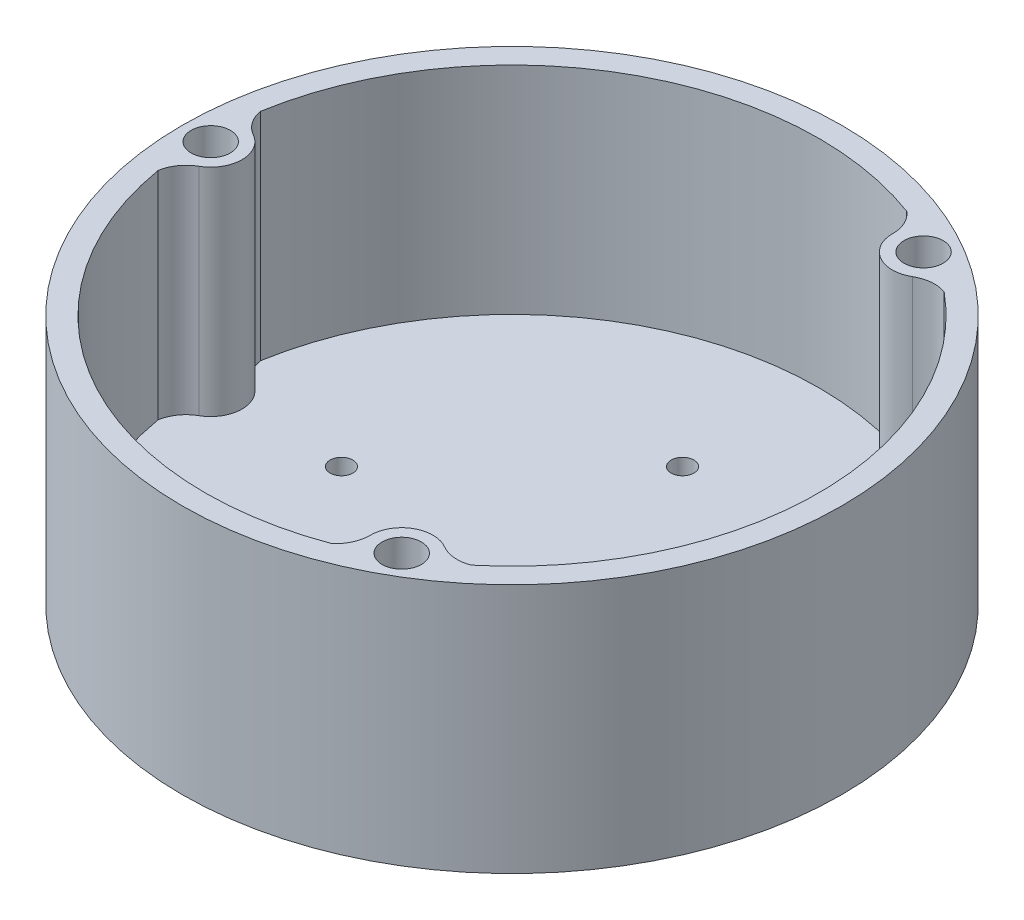
ISO-10303-21;
HEADER;
FILE_DESCRIPTION(('STEP AP214'),'2;1');
FILE_NAME('part.step','',(''),(''),'','','');
FILE_SCHEMA(('AUTOMOTIVE_DESIGN { 1 0 10303 214 1 1 1 1 }'));
ENDSEC;
DATA;
#1=APPLICATION_CONTEXT('core data for automotive mechanical design processes');
#2=APPLICATION_PROTOCOL_DEFINITION('international standard','automotive_design',2000,#1);
#3=PRODUCT_CONTEXT('',#1,'mechanical');
#4=PRODUCT('Part','Part','',(#3));
#5=PRODUCT_RELATED_PRODUCT_CATEGORY('part','',(#4));
#6=PRODUCT_DEFINITION_FORMATION('','',#4);
#7=PRODUCT_DEFINITION_CONTEXT('part definition',#1,'design');
#8=PRODUCT_DEFINITION('design','',#6,#7);
#9=PRODUCT_DEFINITION_SHAPE('','',#8);
#10=(LENGTH_UNIT() NAMED_UNIT(*) SI_UNIT(.MILLI.,.METRE.));
#11=(NAMED_UNIT(*) PLANE_ANGLE_UNIT() SI_UNIT($,.RADIAN.));
#12=(NAMED_UNIT(*) SI_UNIT($,.STERADIAN.) SOLID_ANGLE_UNIT());
#13=UNCERTAINTY_MEASURE_WITH_UNIT(LENGTH_MEASURE(1.E-05),#10,'distance_accuracy_value','');
#14=(GEOMETRIC_REPRESENTATION_CONTEXT(3) GLOBAL_UNCERTAINTY_ASSIGNED_CONTEXT((#13)) GLOBAL_UNIT_ASSIGNED_CONTEXT((#10,
#11,#12)) REPRESENTATION_CONTEXT('',''));
#15=CARTESIAN_POINT('',(0.,0.,0.));
#16=DIRECTION('',(0.,0.,1.));
#17=DIRECTION('',(1.,0.,0.));
#18=AXIS2_PLACEMENT_3D('',#15,#16,#17);
#19=CARTESIAN_POINT('',(0.,22.,0.));
#20=DIRECTION('',(0.,-1.,0.));
#21=DIRECTION('',(0.,0.,-1.));
#22=AXIS2_PLACEMENT_3D('',#19,#20,#21);
#23=CYLINDRICAL_SURFACE('',#22,29.);
#24=CARTESIAN_POINT('',(0.,22.,0.));
#25=DIRECTION('',(0.,1.,0.));
#26=DIRECTION('',(0.,0.,1.));
#27=AXIS2_PLACEMENT_3D('',#24,#25,#26);
#28=CIRCLE('',#27,29.);
#29=CARTESIAN_POINT('',(0.,22.,29.));
#30=VERTEX_POINT('',#29);
#31=EDGE_CURVE('E161',#30,#30,#28,.T.);
#32=ORIENTED_EDGE('',*,*,#31,.F.);
#33=EDGE_LOOP('',(#32));
#34=FACE_BOUND('',#33,.T.);
#35=CARTESIAN_POINT('',(0.,0.,0.));
#36=DIRECTION('',(0.,1.,0.));
#37=DIRECTION('',(0.,0.,1.));
#38=AXIS2_PLACEMENT_3D('',#35,#36,#37);
#39=CIRCLE('',#38,29.);
#40=CARTESIAN_POINT('',(0.,0.,29.));
#41=VERTEX_POINT('',#40);
#42=EDGE_CURVE('E196',#41,#41,#39,.T.);
#43=ORIENTED_EDGE('',*,*,#42,.T.);
#44=EDGE_LOOP('',(#43));
#45=FACE_BOUND('',#44,.T.);
#46=ADVANCED_FACE('F61',(#34,#45),#23,.T.);
#47=CARTESIAN_POINT('',(-23.6647204443771,22.,5.00236842320391));
#48=DIRECTION('',(0.,-1.,0.));
#49=DIRECTION('',(0.,0.,-1.));
#50=AXIS2_PLACEMENT_3D('',#47,#48,#49);
#51=CYLINDRICAL_SURFACE('',#50,3.);
#52=DIRECTION('',(0.,-1.,0.));
#53=VECTOR('',#52,1.);
#54=CARTESIAN_POINT('',(-26.6223590239483,22.,4.50000000000005));
#55=LINE('',#54,#53);
#56=CARTESIAN_POINT('',(-26.6223590239483,22.,4.50000000000005));
#57=VERTEX_POINT('',#56);
#58=CARTESIAN_POINT('',(-26.6223590239483,3.,4.50000000000005));
#59=VERTEX_POINT('',#58);
#60=EDGE_CURVE('E12',#57,#59,#55,.T.);
#61=ORIENTED_EDGE('',*,*,#60,.T.);
#62=CARTESIAN_POINT('',(-23.6647204443771,3.,5.00236842320391));
#63=DIRECTION('',(0.,1.,0.));
#64=DIRECTION('',(0.,0.,1.));
#65=AXIS2_PLACEMENT_3D('',#62,#63,#64);
#66=CIRCLE('',#65,3.);
#67=CARTESIAN_POINT('',(-25.1439967342673,3.,2.39243707196712));
#68=VERTEX_POINT('',#67);
#69=EDGE_CURVE('E75',#59,#68,#66,.F.);
#70=ORIENTED_EDGE('',*,*,#69,.T.);
#71=DIRECTION('',(0.,-1.,0.));
#72=VECTOR('',#71,1.);
#73=CARTESIAN_POINT('',(-25.1439967342673,22.,2.39243707196712));
#74=LINE('',#73,#72);
#75=CARTESIAN_POINT('',(-25.1439967342673,22.,2.39243707196712));
#76=VERTEX_POINT('',#75);
#77=EDGE_CURVE('E69',#76,#68,#74,.T.);
#78=ORIENTED_EDGE('',*,*,#77,.F.);
#79=CARTESIAN_POINT('',(-23.6647204443771,22.,5.00236842320391));
#80=DIRECTION('',(0.,1.,0.));
#81=DIRECTION('',(0.,0.,1.));
#82=AXIS2_PLACEMENT_3D('',#79,#80,#81);
#83=CIRCLE('',#82,3.);
#84=EDGE_CURVE('E212',#57,#76,#83,.F.);
#85=ORIENTED_EDGE('',*,*,#84,.F.);
#86=EDGE_LOOP('',(#61,#70,#78,#85));
#87=FACE_BOUND('',#86,.T.);
#88=ADVANCED_FACE('F280',(#87),#51,.F.);
#89=CARTESIAN_POINT('',(-26.5,22.,0.));
#90=DIRECTION('',(0.,-1.,0.));
#91=DIRECTION('',(0.,0.,-1.));
#92=AXIS2_PLACEMENT_3D('',#89,#90,#91);
#93=CYLINDRICAL_SURFACE('',#92,2.75);
#94=ORIENTED_EDGE('',*,*,#77,.T.);
#95=CARTESIAN_POINT('',(-26.5,3.,0.));
#96=DIRECTION('',(0.,1.,0.));
#97=DIRECTION('',(0.,0.,1.));
#98=AXIS2_PLACEMENT_3D('',#95,#96,#97);
#99=CIRCLE('',#98,2.75);
#100=CARTESIAN_POINT('',(-25.1439967342673,3.,-2.39243707196699));
#101=VERTEX_POINT('',#100);
#102=EDGE_CURVE('E82',#68,#101,#99,.T.);
#103=ORIENTED_EDGE('',*,*,#102,.T.);
#104=DIRECTION('',(0.,-1.,0.));
#105=VECTOR('',#104,1.);
#106=CARTESIAN_POINT('',(-25.1439967342673,22.,-2.39243707196699));
#107=LINE('',#106,#105);
#108=CARTESIAN_POINT('',(-25.1439967342673,22.,-2.39243707196699));
#109=VERTEX_POINT('',#108);
#110=EDGE_CURVE('E262',#109,#101,#107,.T.);
#111=ORIENTED_EDGE('',*,*,#110,.F.);
#112=CARTESIAN_POINT('',(-26.5,22.,0.));
#113=DIRECTION('',(0.,1.,0.));
#114=DIRECTION('',(0.,0.,1.));
#115=AXIS2_PLACEMENT_3D('',#112,#113,#114);
#116=CIRCLE('',#115,2.75);
#117=EDGE_CURVE('E214',#76,#109,#116,.T.);
#118=ORIENTED_EDGE('',*,*,#117,.F.);
#119=EDGE_LOOP('',(#94,#103,#111,#118));
#120=FACE_BOUND('',#119,.T.);
#121=ADVANCED_FACE('F264',(#120),#93,.T.);
#122=CARTESIAN_POINT('',(-23.6647204443771,22.,-5.00236842320378));
#123=DIRECTION('',(0.,-1.,0.));
#124=DIRECTION('',(0.,0.,-1.));
#125=AXIS2_PLACEMENT_3D('',#122,#123,#124);
#126=CYLINDRICAL_SURFACE('',#125,3.);
#127=ORIENTED_EDGE('',*,*,#110,.T.);
#128=CARTESIAN_POINT('',(-23.6647204443771,3.,-5.00236842320378));
#129=DIRECTION('',(0.,1.,0.));
#130=DIRECTION('',(0.,0.,1.));
#131=AXIS2_PLACEMENT_3D('',#128,#129,#130);
#132=CIRCLE('',#131,3.);
#133=CARTESIAN_POINT('',(-26.6223590239483,3.,-4.49999999999994));
#134=VERTEX_POINT('',#133);
#135=EDGE_CURVE('E193',#101,#134,#132,.F.);
#136=ORIENTED_EDGE('',*,*,#135,.T.);
#137=DIRECTION('',(0.,-1.,0.));
#138=VECTOR('',#137,1.);
#139=CARTESIAN_POINT('',(-26.6223590239483,22.,-4.49999999999994));
#140=LINE('',#139,#138);
#141=CARTESIAN_POINT('',(-26.6223590239483,22.,-4.49999999999994));
#142=VERTEX_POINT('',#141);
#143=EDGE_CURVE('E259',#142,#134,#140,.T.);
#144=ORIENTED_EDGE('',*,*,#143,.F.);
#145=CARTESIAN_POINT('',(-23.6647204443771,22.,-5.00236842320378));
#146=DIRECTION('',(0.,1.,0.));
#147=DIRECTION('',(0.,0.,1.));
#148=AXIS2_PLACEMENT_3D('',#145,#146,#147);
#149=CIRCLE('',#148,3.);
#150=EDGE_CURVE('E216',#109,#142,#149,.F.);
#151=ORIENTED_EDGE('',*,*,#150,.F.);
#152=EDGE_LOOP('',(#127,#136,#144,#151));
#153=FACE_BOUND('',#152,.T.);
#154=ADVANCED_FACE('F270',(#153),#126,.F.);
#155=CARTESIAN_POINT('',(0.,22.,0.));
#156=DIRECTION('',(0.,-1.,0.));
#157=DIRECTION('',(0.,0.,-1.));
#158=AXIS2_PLACEMENT_3D('',#155,#156,#157);
#159=CYLINDRICAL_SURFACE('',#158,27.);
#160=CARTESIAN_POINT('',(0.,3.,0.));
#161=DIRECTION('',(0.,1.,0.));
#162=DIRECTION('',(0.,0.,1.));
#163=AXIS2_PLACEMENT_3D('',#160,#161,#162);
#164=CIRCLE('',#163,27.);
#165=CARTESIAN_POINT('',(9.41406519494411,3.,-25.3056392234091));
#166=VERTEX_POINT('',#165);
#167=EDGE_CURVE('E190',#166,#134,#164,.T.);
#168=ORIENTED_EDGE('',*,*,#167,.F.);
#169=DIRECTION('',(0.,-1.,0.));
#170=VECTOR('',#169,1.);
#171=CARTESIAN_POINT('',(9.41406519494411,22.,-25.3056392234091));
#172=LINE('',#171,#170);
#173=CARTESIAN_POINT('',(9.41406519494411,22.,-25.3056392234091));
#174=VERTEX_POINT('',#173);
#175=EDGE_CURVE('E256',#174,#166,#172,.T.);
#176=ORIENTED_EDGE('',*,*,#175,.F.);
#177=CARTESIAN_POINT('',(0.,22.,0.));
#178=DIRECTION('',(0.,1.,0.));
#179=DIRECTION('',(0.,0.,1.));
#180=AXIS2_PLACEMENT_3D('',#177,#178,#179);
#181=CIRCLE('',#180,27.);
#182=EDGE_CURVE('E218',#174,#142,#181,.T.);
#183=ORIENTED_EDGE('',*,*,#182,.T.);
#184=ORIENTED_EDGE('',*,*,#143,.T.);
#185=EDGE_LOOP('',(#168,#176,#183,#184));
#186=FACE_BOUND('',#185,.T.);
#187=ADVANCED_FACE('F273',(#186),#159,.F.);
#188=CARTESIAN_POINT('',(7.50018208860487,22.,-22.9954332898895));
#189=DIRECTION('',(0.,-1.,0.));
#190=DIRECTION('',(0.,0.,-1.));
#191=AXIS2_PLACEMENT_3D('',#188,#189,#190);
#192=CYLINDRICAL_SURFACE('',#191,3.);
#193=ORIENTED_EDGE('',*,*,#175,.T.);
#194=CARTESIAN_POINT('',(7.50018208860487,3.,-22.9954332898895));
#195=DIRECTION('',(0.,1.,0.));
#196=DIRECTION('',(0.,0.,1.));
#197=AXIS2_PLACEMENT_3D('',#194,#195,#196);
#198=CIRCLE('',#197,3.);
#199=CARTESIAN_POINT('',(10.5000870858545,3.,-22.971558460532));
#200=VERTEX_POINT('',#199);
#201=EDGE_CURVE('E188',#166,#200,#198,.F.);
#202=ORIENTED_EDGE('',*,*,#201,.T.);
#203=DIRECTION('',(0.,-1.,0.));
#204=VECTOR('',#203,1.);
#205=CARTESIAN_POINT('',(10.5000870858545,22.,-22.971558460532));
#206=LINE('',#205,#204);
#207=CARTESIAN_POINT('',(10.5000870858545,22.,-22.971558460532));
#208=VERTEX_POINT('',#207);
#209=EDGE_CURVE('E253',#208,#200,#206,.T.);
#210=ORIENTED_EDGE('',*,*,#209,.F.);
#211=CARTESIAN_POINT('',(7.50018208860487,22.,-22.9954332898895));
#212=DIRECTION('',(0.,1.,0.));
#213=DIRECTION('',(0.,0.,1.));
#214=AXIS2_PLACEMENT_3D('',#211,#212,#213);
#215=CIRCLE('',#214,3.);
#216=EDGE_CURVE('E221',#174,#208,#215,.F.);
#217=ORIENTED_EDGE('',*,*,#216,.F.);
#218=EDGE_LOOP('',(#193,#202,#210,#217));
#219=FACE_BOUND('',#218,.T.);
#220=ADVANCED_FACE('F294',(#219),#192,.F.);
#221=CARTESIAN_POINT('',(13.2499999999999,22.,-22.9496732002877));
#222=DIRECTION('',(0.,-1.,0.));
#223=DIRECTION('',(0.,0.,-1.));
#224=AXIS2_PLACEMENT_3D('',#221,#222,#223);
#225=CYLINDRICAL_SURFACE('',#224,2.75);
#226=ORIENTED_EDGE('',*,*,#209,.T.);
#227=CARTESIAN_POINT('',(13.2499999999999,3.,-22.9496732002877));
#228=DIRECTION('',(0.,1.,0.));
#229=DIRECTION('',(0.,0.,1.));
#230=AXIS2_PLACEMENT_3D('',#227,#228,#229);
#231=CIRCLE('',#230,2.75);
#232=CARTESIAN_POINT('',(14.6439096484127,3.,-20.579121388565));
#233=VERTEX_POINT('',#232);
#234=EDGE_CURVE('E186',#200,#233,#231,.T.);
#235=ORIENTED_EDGE('',*,*,#234,.T.);
#236=DIRECTION('',(0.,-1.,0.));
#237=VECTOR('',#236,1.);
#238=CARTESIAN_POINT('',(14.6439096484127,22.,-20.579121388565));
#239=LINE('',#238,#237);
#240=CARTESIAN_POINT('',(14.6439096484127,22.,-20.579121388565));
#241=VERTEX_POINT('',#240);
#242=EDGE_CURVE('E250',#241,#233,#239,.T.);
#243=ORIENTED_EDGE('',*,*,#242,.F.);
#244=CARTESIAN_POINT('',(13.2499999999999,22.,-22.9496732002877));
#245=DIRECTION('',(0.,1.,0.));
#246=DIRECTION('',(0.,0.,1.));
#247=AXIS2_PLACEMENT_3D('',#244,#245,#246);
#248=CIRCLE('',#247,2.75);
#249=EDGE_CURVE('E223',#208,#241,#248,.T.);
#250=ORIENTED_EDGE('',*,*,#249,.F.);
#251=EDGE_LOOP('',(#226,#235,#243,#250));
#252=FACE_BOUND('',#251,.T.);
#253=ADVANCED_FACE('F297',(#252),#225,.T.);
#254=CARTESIAN_POINT('',(16.1645383557721,22.,-17.9930648666857));
#255=DIRECTION('',(0.,-1.,0.));
#256=DIRECTION('',(0.,0.,-1.));
#257=AXIS2_PLACEMENT_3D('',#254,#255,#256);
#258=CYLINDRICAL_SURFACE('',#257,3.);
#259=ORIENTED_EDGE('',*,*,#242,.T.);
#260=CARTESIAN_POINT('',(16.1645383557721,3.,-17.9930648666857));
#261=DIRECTION('',(0.,1.,0.));
#262=DIRECTION('',(0.,0.,1.));
#263=AXIS2_PLACEMENT_3D('',#260,#261,#262);
#264=CIRCLE('',#263,3.);
#265=CARTESIAN_POINT('',(17.2082938290041,3.,-20.8056392234091));
#266=VERTEX_POINT('',#265);
#267=EDGE_CURVE('E184',#233,#266,#264,.F.);
#268=ORIENTED_EDGE('',*,*,#267,.T.);
#269=DIRECTION('',(0.,-1.,0.));
#270=VECTOR('',#269,1.);
#271=CARTESIAN_POINT('',(17.2082938290041,22.,-20.8056392234091));
#272=LINE('',#271,#270);
#273=CARTESIAN_POINT('',(17.2082938290041,22.,-20.8056392234091));
#274=VERTEX_POINT('',#273);
#275=EDGE_CURVE('E247',#274,#266,#272,.T.);
#276=ORIENTED_EDGE('',*,*,#275,.F.);
#277=CARTESIAN_POINT('',(16.1645383557721,22.,-17.9930648666857));
#278=DIRECTION('',(0.,1.,0.));
#279=DIRECTION('',(0.,0.,1.));
#280=AXIS2_PLACEMENT_3D('',#277,#278,#279);
#281=CIRCLE('',#280,3.);
#282=EDGE_CURVE('E225',#241,#274,#281,.F.);
#283=ORIENTED_EDGE('',*,*,#282,.F.);
#284=EDGE_LOOP('',(#259,#268,#276,#283));
#285=FACE_BOUND('',#284,.T.);
#286=ADVANCED_FACE('F301',(#285),#258,.F.);
#287=CARTESIAN_POINT('',(0.,22.,0.));
#288=DIRECTION('',(0.,-1.,0.));
#289=DIRECTION('',(0.,0.,-1.));
#290=AXIS2_PLACEMENT_3D('',#287,#288,#289);
#291=CYLINDRICAL_SURFACE('',#290,27.);
#292=CARTESIAN_POINT('',(0.,3.,0.));
#293=DIRECTION('',(0.,1.,0.));
#294=DIRECTION('',(0.,0.,1.));
#295=AXIS2_PLACEMENT_3D('',#292,#293,#294);
#296=CIRCLE('',#295,27.);
#297=CARTESIAN_POINT('',(17.2082938290041,3.,20.8056392234091));
#298=VERTEX_POINT('',#297);
#299=EDGE_CURVE('E181',#298,#266,#296,.T.);
#300=ORIENTED_EDGE('',*,*,#299,.F.);
#301=DIRECTION('',(0.,-1.,0.));
#302=VECTOR('',#301,1.);
#303=CARTESIAN_POINT('',(17.2082938290041,22.,20.8056392234091));
#304=LINE('',#303,#302);
#305=CARTESIAN_POINT('',(17.2082938290041,22.,20.8056392234091));
#306=VERTEX_POINT('',#305);
#307=EDGE_CURVE('E244',#306,#298,#304,.T.);
#308=ORIENTED_EDGE('',*,*,#307,.F.);
#309=CARTESIAN_POINT('',(0.,22.,0.));
#310=DIRECTION('',(0.,1.,0.));
#311=DIRECTION('',(0.,0.,1.));
#312=AXIS2_PLACEMENT_3D('',#309,#310,#311);
#313=CIRCLE('',#312,27.);
#314=EDGE_CURVE('E227',#306,#274,#313,.T.);
#315=ORIENTED_EDGE('',*,*,#314,.T.);
#316=ORIENTED_EDGE('',*,*,#275,.T.);
#317=EDGE_LOOP('',(#300,#308,#315,#316));
#318=FACE_BOUND('',#317,.T.);
#319=ADVANCED_FACE('F305',(#318),#291,.F.);
#320=CARTESIAN_POINT('',(16.1645383557722,22.,17.9930648666856));
#321=DIRECTION('',(0.,-1.,0.));
#322=DIRECTION('',(0.,0.,-1.));
#323=AXIS2_PLACEMENT_3D('',#320,#321,#322);
#324=CYLINDRICAL_SURFACE('',#323,3.);
#325=ORIENTED_EDGE('',*,*,#307,.T.);
#326=CARTESIAN_POINT('',(16.1645383557722,3.,17.9930648666856));
#327=DIRECTION('',(0.,1.,0.));
#328=DIRECTION('',(0.,0.,1.));
#329=AXIS2_PLACEMENT_3D('',#326,#327,#328);
#330=CIRCLE('',#329,3.);
#331=CARTESIAN_POINT('',(14.6439096484128,3.,20.5791213885649));
#332=VERTEX_POINT('',#331);
#333=EDGE_CURVE('E179',#298,#332,#330,.F.);
#334=ORIENTED_EDGE('',*,*,#333,.T.);
#335=DIRECTION('',(0.,-1.,0.));
#336=VECTOR('',#335,1.);
#337=CARTESIAN_POINT('',(14.6439096484128,22.,20.5791213885649));
#338=LINE('',#337,#336);
#339=CARTESIAN_POINT('',(14.6439096484128,22.,20.5791213885649));
#340=VERTEX_POINT('',#339);
#341=EDGE_CURVE('E241',#340,#332,#338,.T.);
#342=ORIENTED_EDGE('',*,*,#341,.F.);
#343=CARTESIAN_POINT('',(16.1645383557722,22.,17.9930648666856));
#344=DIRECTION('',(0.,1.,0.));
#345=DIRECTION('',(0.,0.,1.));
#346=AXIS2_PLACEMENT_3D('',#343,#344,#345);
#347=CIRCLE('',#346,3.);
#348=EDGE_CURVE('E230',#306,#340,#347,.F.);
#349=ORIENTED_EDGE('',*,*,#348,.F.);
#350=EDGE_LOOP('',(#325,#334,#342,#349));
#351=FACE_BOUND('',#350,.T.);
#352=ADVANCED_FACE('F309',(#351),#324,.F.);
#353=CARTESIAN_POINT('',(13.2500000000001,22.,22.9496732002876));
#354=DIRECTION('',(0.,-1.,0.));
#355=DIRECTION('',(0.,0.,-1.));
#356=AXIS2_PLACEMENT_3D('',#353,#354,#355);
#357=CYLINDRICAL_SURFACE('',#356,2.75);
#358=ORIENTED_EDGE('',*,*,#341,.T.);
#359=CARTESIAN_POINT('',(13.2500000000001,3.,22.9496732002876));
#360=DIRECTION('',(0.,1.,0.));
#361=DIRECTION('',(0.,0.,1.));
#362=AXIS2_PLACEMENT_3D('',#359,#360,#361);
#363=CIRCLE('',#362,2.75);
#364=CARTESIAN_POINT('',(10.5000870858546,3.,22.971558460532));
#365=VERTEX_POINT('',#364);
#366=EDGE_CURVE('E170',#332,#365,#363,.T.);
#367=ORIENTED_EDGE('',*,*,#366,.T.);
#368=DIRECTION('',(0.,-1.,0.));
#369=VECTOR('',#368,1.);
#370=CARTESIAN_POINT('',(10.5000870858546,22.,22.971558460532));
#371=LINE('',#370,#369);
#372=CARTESIAN_POINT('',(10.5000870858546,22.,22.971558460532));
#373=VERTEX_POINT('',#372);
#374=EDGE_CURVE('E160',#373,#365,#371,.T.);
#375=ORIENTED_EDGE('',*,*,#374,.F.);
#376=CARTESIAN_POINT('',(13.2500000000001,22.,22.9496732002876));
#377=DIRECTION('',(0.,1.,0.));
#378=DIRECTION('',(0.,0.,1.));
#379=AXIS2_PLACEMENT_3D('',#376,#377,#378);
#380=CIRCLE('',#379,2.75);
#381=EDGE_CURVE('E232',#340,#373,#380,.T.);
#382=ORIENTED_EDGE('',*,*,#381,.F.);
#383=EDGE_LOOP('',(#358,#367,#375,#382));
#384=FACE_BOUND('',#383,.T.);
#385=ADVANCED_FACE('F313',(#384),#357,.T.);
#386=CARTESIAN_POINT('',(7.50018208860498,22.,22.9954332898895));
#387=DIRECTION('',(0.,-1.,0.));
#388=DIRECTION('',(0.,0.,-1.));
#389=AXIS2_PLACEMENT_3D('',#386,#387,#388);
#390=CYLINDRICAL_SURFACE('',#389,3.);
#391=ORIENTED_EDGE('',*,*,#374,.T.);
#392=CARTESIAN_POINT('',(7.50018208860498,3.,22.9954332898895));
#393=DIRECTION('',(0.,1.,0.));
#394=DIRECTION('',(0.,0.,1.));
#395=AXIS2_PLACEMENT_3D('',#392,#393,#394);
#396=CIRCLE('',#395,3.);
#397=CARTESIAN_POINT('',(9.41406519494423,3.,25.3056392234091));
#398=VERTEX_POINT('',#397);
#399=EDGE_CURVE('E165',#365,#398,#396,.F.);
#400=ORIENTED_EDGE('',*,*,#399,.T.);
#401=DIRECTION('',(0.,-1.,0.));
#402=VECTOR('',#401,1.);
#403=CARTESIAN_POINT('',(9.41406519494423,22.,25.3056392234091));
#404=LINE('',#403,#402);
#405=CARTESIAN_POINT('',(9.41406519494423,22.,25.3056392234091));
#406=VERTEX_POINT('',#405);
#407=EDGE_CURVE('E152',#406,#398,#404,.T.);
#408=ORIENTED_EDGE('',*,*,#407,.F.);
#409=CARTESIAN_POINT('',(7.50018208860498,22.,22.9954332898895));
#410=DIRECTION('',(0.,1.,0.));
#411=DIRECTION('',(0.,0.,1.));
#412=AXIS2_PLACEMENT_3D('',#409,#410,#411);
#413=CIRCLE('',#412,3.);
#414=EDGE_CURVE('E234',#373,#406,#413,.F.);
#415=ORIENTED_EDGE('',*,*,#414,.F.);
#416=EDGE_LOOP('',(#391,#400,#408,#415));
#417=FACE_BOUND('',#416,.T.);
#418=ADVANCED_FACE('F166',(#417),#390,.F.);
#419=CARTESIAN_POINT('',(0.,22.,0.));
#420=DIRECTION('',(0.,-1.,0.));
#421=DIRECTION('',(0.,0.,-1.));
#422=AXIS2_PLACEMENT_3D('',#419,#420,#421);
#423=CYLINDRICAL_SURFACE('',#422,27.);
#424=CARTESIAN_POINT('',(0.,3.,0.));
#425=DIRECTION('',(0.,1.,0.));
#426=DIRECTION('',(0.,0.,1.));
#427=AXIS2_PLACEMENT_3D('',#424,#425,#426);
#428=CIRCLE('',#427,27.);
#429=EDGE_CURVE('E155',#59,#398,#428,.T.);
#430=ORIENTED_EDGE('',*,*,#429,.F.);
#431=ORIENTED_EDGE('',*,*,#60,.F.);
#432=CARTESIAN_POINT('',(0.,22.,0.));
#433=DIRECTION('',(0.,1.,0.));
#434=DIRECTION('',(0.,0.,1.));
#435=AXIS2_PLACEMENT_3D('',#432,#433,#434);
#436=CIRCLE('',#435,27.);
#437=EDGE_CURVE('E157',#57,#406,#436,.T.);
#438=ORIENTED_EDGE('',*,*,#437,.T.);
#439=ORIENTED_EDGE('',*,*,#407,.T.);
#440=EDGE_LOOP('',(#430,#431,#438,#439));
#441=FACE_BOUND('',#440,.T.);
#442=ADVANCED_FACE('F63',(#441),#423,.F.);
#443=CARTESIAN_POINT('',(0.,0.,0.));
#444=DIRECTION('',(0.,1.,0.));
#445=DIRECTION('',(0.,0.,1.));
#446=AXIS2_PLACEMENT_3D('',#443,#444,#445);
#447=PLANE('',#446);
#448=ORIENTED_EDGE('',*,*,#42,.F.);
#449=EDGE_LOOP('',(#448));
#450=FACE_BOUND('',#449,.T.);
#451=CARTESIAN_POINT('',(0.,0.,-15.));
#452=DIRECTION('',(0.,1.,0.));
#453=DIRECTION('',(0.,0.,1.));
#454=AXIS2_PLACEMENT_3D('',#451,#452,#453);
#455=CIRCLE('',#454,1.);
#456=CARTESIAN_POINT('',(0.,0.,-14.));
#457=VERTEX_POINT('',#456);
#458=EDGE_CURVE('E197',#457,#457,#455,.T.);
#459=ORIENTED_EDGE('',*,*,#458,.T.);
#460=EDGE_LOOP('',(#459));
#461=FACE_BOUND('',#460,.T.);
#462=CARTESIAN_POINT('',(15.,0.,0.));
#463=DIRECTION('',(0.,1.,0.));
#464=DIRECTION('',(0.,0.,1.));
#465=AXIS2_PLACEMENT_3D('',#462,#463,#464);
#466=CIRCLE('',#465,1.);
#467=CARTESIAN_POINT('',(15.,0.,1.));
#468=VERTEX_POINT('',#467);
#469=EDGE_CURVE('E200',#468,#468,#466,.T.);
#470=ORIENTED_EDGE('',*,*,#469,.T.);
#471=EDGE_LOOP('',(#470));
#472=FACE_BOUND('',#471,.T.);
#473=CARTESIAN_POINT('',(0.,0.,15.));
#474=DIRECTION('',(0.,1.,0.));
#475=DIRECTION('',(0.,0.,1.));
#476=AXIS2_PLACEMENT_3D('',#473,#474,#475);
#477=CIRCLE('',#476,0.999999999999999);
#478=CARTESIAN_POINT('',(0.,0.,16.));
#479=VERTEX_POINT('',#478);
#480=EDGE_CURVE('E204',#479,#479,#477,.T.);
#481=ORIENTED_EDGE('',*,*,#480,.T.);
#482=EDGE_LOOP('',(#481));
#483=FACE_BOUND('',#482,.T.);
#484=CARTESIAN_POINT('',(-15.,0.,0.));
#485=DIRECTION('',(0.,1.,0.));
#486=DIRECTION('',(0.,0.,1.));
#487=AXIS2_PLACEMENT_3D('',#484,#485,#486);
#488=CIRCLE('',#487,1.);
#489=CARTESIAN_POINT('',(-15.,0.,1.));
#490=VERTEX_POINT('',#489);
#491=EDGE_CURVE('E207',#490,#490,#488,.T.);
#492=ORIENTED_EDGE('',*,*,#491,.T.);
#493=EDGE_LOOP('',(#492));
#494=FACE_BOUND('',#493,.T.);
#495=ADVANCED_FACE('F320',(#450,#461,#472,#483,#494),#447,.F.);
#496=CARTESIAN_POINT('',(0.,22.,0.));
#497=DIRECTION('',(0.,1.,0.));
#498=DIRECTION('',(0.,0.,1.));
#499=AXIS2_PLACEMENT_3D('',#496,#497,#498);
#500=PLANE('',#499);
#501=CARTESIAN_POINT('',(-26.5,22.,0.));
#502=DIRECTION('',(0.,1.,0.));
#503=DIRECTION('',(0.,0.,1.));
#504=AXIS2_PLACEMENT_3D('',#501,#502,#503);
#505=CIRCLE('',#504,1.725);
#506=CARTESIAN_POINT('',(-26.5,22.,1.72500000000007));
#507=VERTEX_POINT('',#506);
#508=EDGE_CURVE('E373',#507,#507,#505,.T.);
#509=ORIENTED_EDGE('',*,*,#508,.F.);
#510=EDGE_LOOP('',(#509));
#511=FACE_BOUND('',#510,.T.);
#512=CARTESIAN_POINT('',(13.2499999999999,22.,-22.9496732002877));
#513=DIRECTION('',(0.,1.,0.));
#514=DIRECTION('',(0.,0.,1.));
#515=AXIS2_PLACEMENT_3D('',#512,#513,#514);
#516=CIRCLE('',#515,1.725);
#517=CARTESIAN_POINT('',(13.2499999999999,22.,-21.2246732002877));
#518=VERTEX_POINT('',#517);
#519=EDGE_CURVE('E376',#518,#518,#516,.T.);
#520=ORIENTED_EDGE('',*,*,#519,.F.);
#521=EDGE_LOOP('',(#520));
#522=FACE_BOUND('',#521,.T.);
#523=CARTESIAN_POINT('',(13.2500000000001,22.,22.9496732002876));
#524=DIRECTION('',(0.,1.,0.));
#525=DIRECTION('',(0.,0.,1.));
#526=AXIS2_PLACEMENT_3D('',#523,#524,#525);
#527=CIRCLE('',#526,1.725);
#528=CARTESIAN_POINT('',(13.2500000000001,22.,24.6746732002876));
#529=VERTEX_POINT('',#528);
#530=EDGE_CURVE('E384',#529,#529,#527,.T.);
#531=ORIENTED_EDGE('',*,*,#530,.F.);
#532=EDGE_LOOP('',(#531));
#533=FACE_BOUND('',#532,.T.);
#534=ORIENTED_EDGE('',*,*,#437,.F.);
#535=ORIENTED_EDGE('',*,*,#84,.T.);
#536=ORIENTED_EDGE('',*,*,#117,.T.);
#537=ORIENTED_EDGE('',*,*,#150,.T.);
#538=ORIENTED_EDGE('',*,*,#182,.F.);
#539=ORIENTED_EDGE('',*,*,#216,.T.);
#540=ORIENTED_EDGE('',*,*,#249,.T.);
#541=ORIENTED_EDGE('',*,*,#282,.T.);
#542=ORIENTED_EDGE('',*,*,#314,.F.);
#543=ORIENTED_EDGE('',*,*,#348,.T.);
#544=ORIENTED_EDGE('',*,*,#381,.T.);
#545=ORIENTED_EDGE('',*,*,#414,.T.);
#546=EDGE_LOOP('',(#534,#535,#536,#537,#538,#539,#540,#541,#542,#543,#544,#545));
#547=FACE_BOUND('',#546,.T.);
#548=ORIENTED_EDGE('',*,*,#31,.T.);
#549=EDGE_LOOP('',(#548));
#550=FACE_BOUND('',#549,.T.);
#551=ADVANCED_FACE('F277',(#511,#522,#533,#547,#550),#500,.T.);
#552=CARTESIAN_POINT('',(-15.,3.,0.));
#553=DIRECTION('',(0.,-1.,0.));
#554=DIRECTION('',(0.,0.,-1.));
#555=AXIS2_PLACEMENT_3D('',#552,#553,#554);
#556=CYLINDRICAL_SURFACE('',#555,1.);
#557=CARTESIAN_POINT('',(-15.,3.,0.));
#558=DIRECTION('',(0.,1.,0.));
#559=DIRECTION('',(0.,0.,1.));
#560=AXIS2_PLACEMENT_3D('',#557,#558,#559);
#561=CIRCLE('',#560,1.);
#562=CARTESIAN_POINT('',(-15.,3.,1.));
#563=VERTEX_POINT('',#562);
#564=EDGE_CURVE('E174',#563,#563,#561,.T.);
#565=ORIENTED_EDGE('',*,*,#564,.T.);
#566=EDGE_LOOP('',(#565));
#567=FACE_BOUND('',#566,.T.);
#568=ORIENTED_EDGE('',*,*,#491,.F.);
#569=EDGE_LOOP('',(#568));
#570=FACE_BOUND('',#569,.T.);
#571=ADVANCED_FACE('F326',(#567,#570),#556,.F.);
#572=CARTESIAN_POINT('',(0.,3.,15.));
#573=DIRECTION('',(0.,-1.,0.));
#574=DIRECTION('',(0.,0.,-1.));
#575=AXIS2_PLACEMENT_3D('',#572,#573,#574);
#576=CYLINDRICAL_SURFACE('',#575,0.999999999999999);
#577=CARTESIAN_POINT('',(0.,3.,15.));
#578=DIRECTION('',(0.,1.,0.));
#579=DIRECTION('',(0.,0.,1.));
#580=AXIS2_PLACEMENT_3D('',#577,#578,#579);
#581=CIRCLE('',#580,0.999999999999999);
#582=CARTESIAN_POINT('',(0.,3.,16.));
#583=VERTEX_POINT('',#582);
#584=EDGE_CURVE('E395',#583,#583,#581,.T.);
#585=ORIENTED_EDGE('',*,*,#584,.T.);
#586=EDGE_LOOP('',(#585));
#587=FACE_BOUND('',#586,.T.);
#588=ORIENTED_EDGE('',*,*,#480,.F.);
#589=EDGE_LOOP('',(#588));
#590=FACE_BOUND('',#589,.T.);
#591=ADVANCED_FACE('F335',(#587,#590),#576,.F.);
#592=CARTESIAN_POINT('',(15.,3.,0.));
#593=DIRECTION('',(0.,-1.,0.));
#594=DIRECTION('',(0.,0.,-1.));
#595=AXIS2_PLACEMENT_3D('',#592,#593,#594);
#596=CYLINDRICAL_SURFACE('',#595,1.);
#597=CARTESIAN_POINT('',(15.,3.,0.));
#598=DIRECTION('',(0.,1.,0.));
#599=DIRECTION('',(0.,0.,1.));
#600=AXIS2_PLACEMENT_3D('',#597,#598,#599);
#601=CIRCLE('',#600,1.);
#602=CARTESIAN_POINT('',(15.,3.,1.));
#603=VERTEX_POINT('',#602);
#604=EDGE_CURVE('E392',#603,#603,#601,.T.);
#605=ORIENTED_EDGE('',*,*,#604,.T.);
#606=EDGE_LOOP('',(#605));
#607=FACE_BOUND('',#606,.T.);
#608=ORIENTED_EDGE('',*,*,#469,.F.);
#609=EDGE_LOOP('',(#608));
#610=FACE_BOUND('',#609,.T.);
#611=ADVANCED_FACE('F331',(#607,#610),#596,.F.);
#612=CARTESIAN_POINT('',(0.,3.,-15.));
#613=DIRECTION('',(0.,-1.,0.));
#614=DIRECTION('',(0.,0.,-1.));
#615=AXIS2_PLACEMENT_3D('',#612,#613,#614);
#616=CYLINDRICAL_SURFACE('',#615,1.);
#617=CARTESIAN_POINT('',(0.,3.,-15.));
#618=DIRECTION('',(0.,1.,0.));
#619=DIRECTION('',(0.,0.,1.));
#620=AXIS2_PLACEMENT_3D('',#617,#618,#619);
#621=CIRCLE('',#620,1.);
#622=CARTESIAN_POINT('',(0.,3.,-14.));
#623=VERTEX_POINT('',#622);
#624=EDGE_CURVE('E210',#623,#623,#621,.T.);
#625=ORIENTED_EDGE('',*,*,#624,.T.);
#626=EDGE_LOOP('',(#625));
#627=FACE_BOUND('',#626,.T.);
#628=ORIENTED_EDGE('',*,*,#458,.F.);
#629=EDGE_LOOP('',(#628));
#630=FACE_BOUND('',#629,.T.);
#631=ADVANCED_FACE('F328',(#627,#630),#616,.F.);
#632=CARTESIAN_POINT('',(0.,3.,0.));
#633=DIRECTION('',(0.,1.,0.));
#634=DIRECTION('',(0.,0.,1.));
#635=AXIS2_PLACEMENT_3D('',#632,#633,#634);
#636=PLANE('',#635);
#637=ORIENTED_EDGE('',*,*,#624,.F.);
#638=EDGE_LOOP('',(#637));
#639=FACE_BOUND('',#638,.T.);
#640=ORIENTED_EDGE('',*,*,#604,.F.);
#641=EDGE_LOOP('',(#640));
#642=FACE_BOUND('',#641,.T.);
#643=ORIENTED_EDGE('',*,*,#584,.F.);
#644=EDGE_LOOP('',(#643));
#645=FACE_BOUND('',#644,.T.);
#646=ORIENTED_EDGE('',*,*,#564,.F.);
#647=EDGE_LOOP('',(#646));
#648=FACE_BOUND('',#647,.T.);
#649=ORIENTED_EDGE('',*,*,#69,.F.);
#650=ORIENTED_EDGE('',*,*,#429,.T.);
#651=ORIENTED_EDGE('',*,*,#399,.F.);
#652=ORIENTED_EDGE('',*,*,#366,.F.);
#653=ORIENTED_EDGE('',*,*,#333,.F.);
#654=ORIENTED_EDGE('',*,*,#299,.T.);
#655=ORIENTED_EDGE('',*,*,#267,.F.);
#656=ORIENTED_EDGE('',*,*,#234,.F.);
#657=ORIENTED_EDGE('',*,*,#201,.F.);
#658=ORIENTED_EDGE('',*,*,#167,.T.);
#659=ORIENTED_EDGE('',*,*,#135,.F.);
#660=ORIENTED_EDGE('',*,*,#102,.F.);
#661=EDGE_LOOP('',(#649,#650,#651,#652,#653,#654,#655,#656,#657,#658,#659,#660));
#662=FACE_BOUND('',#661,.T.);
#663=ADVANCED_FACE('F172',(#639,#642,#645,#648,#662),#636,.T.);
#664=CARTESIAN_POINT('',(13.2500000000001,19.,22.9496732002876));
#665=DIRECTION('',(0.,1.,0.));
#666=DIRECTION('',(0.,0.,1.));
#667=AXIS2_PLACEMENT_3D('',#664,#665,#666);
#668=CYLINDRICAL_SURFACE('',#667,1.725);
#669=CARTESIAN_POINT('',(13.2500000000001,19.,22.9496732002876));
#670=DIRECTION('',(0.,1.,0.));
#671=DIRECTION('',(0.,0.,1.));
#672=AXIS2_PLACEMENT_3D('',#669,#670,#671);
#673=CIRCLE('',#672,1.725);
#674=CARTESIAN_POINT('',(13.2500000000001,19.,24.6746732002876));
#675=VERTEX_POINT('',#674);
#676=EDGE_CURVE('E387',#675,#675,#673,.T.);
#677=ORIENTED_EDGE('',*,*,#676,.F.);
#678=EDGE_LOOP('',(#677));
#679=FACE_BOUND('',#678,.T.);
#680=ORIENTED_EDGE('',*,*,#530,.T.);
#681=EDGE_LOOP('',(#680));
#682=FACE_BOUND('',#681,.T.);
#683=ADVANCED_FACE('F345',(#679,#682),#668,.F.);
#684=CARTESIAN_POINT('',(13.2500000000001,19.,22.9496732002876));
#685=DIRECTION('',(0.,1.,0.));
#686=DIRECTION('',(0.,0.,1.));
#687=AXIS2_PLACEMENT_3D('',#684,#685,#686);
#688=PLANE('',#687);
#689=ORIENTED_EDGE('',*,*,#676,.T.);
#690=EDGE_LOOP('',(#689));
#691=FACE_BOUND('',#690,.T.);
#692=ADVANCED_FACE('F347',(#691),#688,.T.);
#693=CARTESIAN_POINT('',(13.2499999999999,19.,-22.9496732002877));
#694=DIRECTION('',(0.,1.,0.));
#695=DIRECTION('',(0.,0.,1.));
#696=AXIS2_PLACEMENT_3D('',#693,#694,#695);
#697=CYLINDRICAL_SURFACE('',#696,1.725);
#698=CARTESIAN_POINT('',(13.2499999999999,19.,-22.9496732002877));
#699=DIRECTION('',(0.,1.,0.));
#700=DIRECTION('',(0.,0.,1.));
#701=AXIS2_PLACEMENT_3D('',#698,#699,#700);
#702=CIRCLE('',#701,1.725);
#703=CARTESIAN_POINT('',(13.2499999999999,19.,-21.2246732002877));
#704=VERTEX_POINT('',#703);
#705=EDGE_CURVE('E381',#704,#704,#702,.T.);
#706=ORIENTED_EDGE('',*,*,#705,.F.);
#707=EDGE_LOOP('',(#706));
#708=FACE_BOUND('',#707,.T.);
#709=ORIENTED_EDGE('',*,*,#519,.T.);
#710=EDGE_LOOP('',(#709));
#711=FACE_BOUND('',#710,.T.);
#712=ADVANCED_FACE('F350',(#708,#711),#697,.F.);
#713=CARTESIAN_POINT('',(13.2499999999999,19.,-22.9496732002877));
#714=DIRECTION('',(0.,1.,0.));
#715=DIRECTION('',(0.,0.,1.));
#716=AXIS2_PLACEMENT_3D('',#713,#714,#715);
#717=PLANE('',#716);
#718=ORIENTED_EDGE('',*,*,#705,.T.);
#719=EDGE_LOOP('',(#718));
#720=FACE_BOUND('',#719,.T.);
#721=ADVANCED_FACE('F355',(#720),#717,.T.);
#722=CARTESIAN_POINT('',(-26.5,19.,0.));
#723=DIRECTION('',(0.,1.,0.));
#724=DIRECTION('',(0.,0.,1.));
#725=AXIS2_PLACEMENT_3D('',#722,#723,#724);
#726=CYLINDRICAL_SURFACE('',#725,1.725);
#727=CARTESIAN_POINT('',(-26.5,19.,0.));
#728=DIRECTION('',(0.,1.,0.));
#729=DIRECTION('',(0.,0.,1.));
#730=AXIS2_PLACEMENT_3D('',#727,#728,#729);
#731=CIRCLE('',#730,1.725);
#732=CARTESIAN_POINT('',(-26.5,19.,1.72500000000007));
#733=VERTEX_POINT('',#732);
#734=EDGE_CURVE('E201',#733,#733,#731,.T.);
#735=ORIENTED_EDGE('',*,*,#734,.F.);
#736=EDGE_LOOP('',(#735));
#737=FACE_BOUND('',#736,.T.);
#738=ORIENTED_EDGE('',*,*,#508,.T.);
#739=EDGE_LOOP('',(#738));
#740=FACE_BOUND('',#739,.T.);
#741=ADVANCED_FACE('F358',(#737,#740),#726,.F.);
#742=CARTESIAN_POINT('',(-26.5,19.,0.));
#743=DIRECTION('',(0.,1.,0.));
#744=DIRECTION('',(0.,0.,1.));
#745=AXIS2_PLACEMENT_3D('',#742,#743,#744);
#746=PLANE('',#745);
#747=ORIENTED_EDGE('',*,*,#734,.T.);
#748=EDGE_LOOP('',(#747));
#749=FACE_BOUND('',#748,.T.);
#750=ADVANCED_FACE('F365',(#749),#746,.T.);
#751=CLOSED_SHELL('',(#46,#88,#121,#154,#187,#220,#253,#286,#319,#352,#385,#418,#442,#495,#551,
#571,#591,#611,#631,#663,#683,#692,#712,#721,#741,#750));
#752=MANIFOLD_SOLID_BREP('B2',#751);
#753=ADVANCED_BREP_SHAPE_REPRESENTATION('',(#18,#752),#14);
#754=SHAPE_DEFINITION_REPRESENTATION(#9,#753);
ENDSEC;
END-ISO-10303-21;
